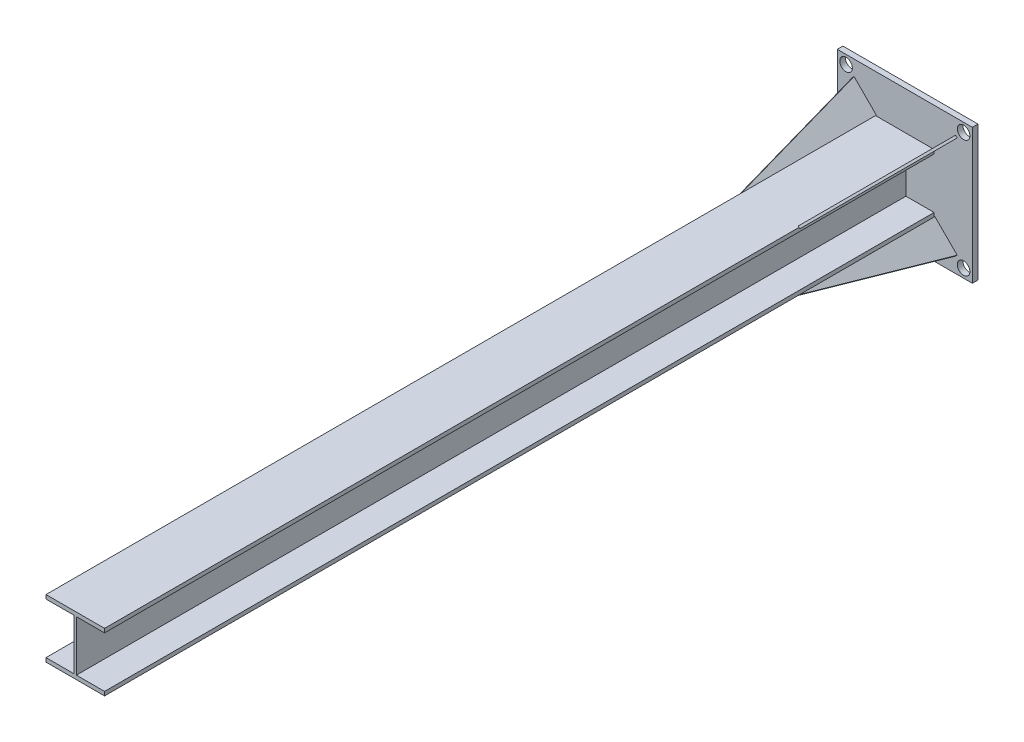
ISO-10303-21;
HEADER;
FILE_DESCRIPTION(('STEP AP214'),'2;1');
FILE_NAME('part.step','',(''),(''),'','','');
FILE_SCHEMA(('AUTOMOTIVE_DESIGN { 1 0 10303 214 1 1 1 1 }'));
ENDSEC;
DATA;
#1=APPLICATION_CONTEXT('core data for automotive mechanical design processes');
#2=APPLICATION_PROTOCOL_DEFINITION('international standard','automotive_design',2000,#1);
#3=PRODUCT_CONTEXT('',#1,'mechanical');
#4=PRODUCT('Part','Part','',(#3));
#5=PRODUCT_RELATED_PRODUCT_CATEGORY('part','',(#4));
#6=PRODUCT_DEFINITION_FORMATION('','',#4);
#7=PRODUCT_DEFINITION_CONTEXT('part definition',#1,'design');
#8=PRODUCT_DEFINITION('design','',#6,#7);
#9=PRODUCT_DEFINITION_SHAPE('','',#8);
#10=(LENGTH_UNIT() NAMED_UNIT(*) SI_UNIT(.MILLI.,.METRE.));
#11=(NAMED_UNIT(*) PLANE_ANGLE_UNIT() SI_UNIT($,.RADIAN.));
#12=(NAMED_UNIT(*) SI_UNIT($,.STERADIAN.) SOLID_ANGLE_UNIT());
#13=UNCERTAINTY_MEASURE_WITH_UNIT(LENGTH_MEASURE(1.E-05),#10,'distance_accuracy_value','');
#14=(GEOMETRIC_REPRESENTATION_CONTEXT(3) GLOBAL_UNCERTAINTY_ASSIGNED_CONTEXT((#13)) GLOBAL_UNIT_ASSIGNED_CONTEXT((#10,
#11,#12)) REPRESENTATION_CONTEXT('',''));
#15=CARTESIAN_POINT('',(0.,0.,0.));
#16=DIRECTION('',(0.,0.,1.));
#17=DIRECTION('',(1.,0.,0.));
#18=AXIS2_PLACEMENT_3D('',#15,#16,#17);
#19=CARTESIAN_POINT('',(3.5355342037314,256.464466391863,0.));
#20=DIRECTION('',(0.707106781186555,0.70710678118654,0.));
#21=DIRECTION('',(-0.70710678118654,0.707106781186555,0.));
#22=AXIS2_PLACEMENT_3D('',#19,#20,#21);
#23=PLANE('',#22);
#24=DIRECTION('',(0.,0.,-1.));
#25=VECTOR('',#24,1.);
#26=CARTESIAN_POINT('',(-3.535533608134,263.535534203729,0.));
#27=LINE('',#26,#25);
#28=CARTESIAN_POINT('',(-3.535533608134,263.535534203729,600.));
#29=VERTEX_POINT('',#28);
#30=CARTESIAN_POINT('',(-3.535533608134,263.535534203729,0.));
#31=VERTEX_POINT('',#30);
#32=EDGE_CURVE('E91',#29,#31,#27,.T.);
#33=ORIENTED_EDGE('',*,*,#32,.T.);
#34=DIRECTION('',(-0.70710678118654,0.707106781186555,0.));
#35=VECTOR('',#34,1.);
#36=CARTESIAN_POINT('',(3.5355342037314,256.464466391863,0.));
#37=LINE('',#36,#35);
#38=CARTESIAN_POINT('',(3.5355342037314,256.464466391863,0.));
#39=VERTEX_POINT('',#38);
#40=EDGE_CURVE('E12',#39,#31,#37,.T.);
#41=ORIENTED_EDGE('',*,*,#40,.F.);
#42=DIRECTION('',(0.,0.,-1.));
#43=VECTOR('',#42,1.);
#44=CARTESIAN_POINT('',(3.5355342037314,256.464466391863,0.));
#45=LINE('',#44,#43);
#46=CARTESIAN_POINT('',(3.5355342037314,256.464466391863,600.));
#47=VERTEX_POINT('',#46);
#48=EDGE_CURVE('E84',#47,#39,#45,.T.);
#49=ORIENTED_EDGE('',*,*,#48,.F.);
#50=DIRECTION('',(-0.70710678118654,0.707106781186555,0.));
#51=VECTOR('',#50,1.);
#52=CARTESIAN_POINT('',(3.5355342037314,256.464466391863,600.));
#53=LINE('',#52,#51);
#54=EDGE_CURVE('E92',#47,#29,#53,.T.);
#55=ORIENTED_EDGE('',*,*,#54,.T.);
#56=EDGE_LOOP('',(#33,#41,#49,#55));
#57=FACE_BOUND('',#56,.T.);
#58=ADVANCED_FACE('F44',(#57),#23,.F.);
#59=CARTESIAN_POINT('',(3.5355342037314,256.464466391863,0.));
#60=DIRECTION('',(0.,0.,1.));
#61=DIRECTION('',(0.,1.,0.));
#62=AXIS2_PLACEMENT_3D('',#59,#60,#61);
#63=PLANE('',#62);
#64=DIRECTION('',(0.707106781186555,0.70710678118654,0.));
#65=VECTOR('',#64,1.);
#66=CARTESIAN_POINT('',(-3.535533608134,263.535534203729,0.));
#67=LINE('',#66,#65);
#68=CARTESIAN_POINT('',(95.4594157579837,362.530483569844,0.));
#69=VERTEX_POINT('',#68);
#70=EDGE_CURVE('E72',#31,#69,#67,.T.);
#71=ORIENTED_EDGE('',*,*,#70,.T.);
#72=DIRECTION('',(-0.70710678118654,0.707106781186555,0.));
#73=VECTOR('',#72,1.);
#74=CARTESIAN_POINT('',(102.530483569849,355.459415757979,0.));
#75=LINE('',#74,#73);
#76=CARTESIAN_POINT('',(102.530483569849,355.459415757979,0.));
#77=VERTEX_POINT('',#76);
#78=EDGE_CURVE('E52',#77,#69,#75,.T.);
#79=ORIENTED_EDGE('',*,*,#78,.F.);
#80=DIRECTION('',(0.707106781186555,0.70710678118654,0.));
#81=VECTOR('',#80,1.);
#82=CARTESIAN_POINT('',(3.5355342037314,256.464466391863,0.));
#83=LINE('',#82,#81);
#84=EDGE_CURVE('E80',#39,#77,#83,.T.);
#85=ORIENTED_EDGE('',*,*,#84,.F.);
#86=ORIENTED_EDGE('',*,*,#40,.T.);
#87=EDGE_LOOP('',(#71,#79,#85,#86));
#88=FACE_BOUND('',#87,.T.);
#89=ADVANCED_FACE('F81',(#88),#63,.F.);
#90=CARTESIAN_POINT('',(3.5355342037314,256.464466391863,600.));
#91=DIRECTION('',(-0.68860972320734,-0.688609723207326,-0.227229615606418));
#92=DIRECTION('',(0.70710678118654,-0.707106781186555,0.));
#93=AXIS2_PLACEMENT_3D('',#90,#91,#92);
#94=PLANE('',#93);
#95=DIRECTION('',(-0.160675602081713,-0.160675602081709,0.973841209741793));
#96=VECTOR('',#95,1.);
#97=CARTESIAN_POINT('',(-3.535533608134,263.535534203729,600.));
#98=LINE('',#97,#96);
#99=EDGE_CURVE('E77',#69,#29,#98,.T.);
#100=ORIENTED_EDGE('',*,*,#99,.T.);
#101=ORIENTED_EDGE('',*,*,#54,.F.);
#102=DIRECTION('',(-0.160675602081713,-0.160675602081709,0.973841209741793));
#103=VECTOR('',#102,1.);
#104=CARTESIAN_POINT('',(3.5355342037314,256.464466391863,600.));
#105=LINE('',#104,#103);
#106=EDGE_CURVE('E60',#77,#47,#105,.T.);
#107=ORIENTED_EDGE('',*,*,#106,.F.);
#108=ORIENTED_EDGE('',*,*,#78,.T.);
#109=EDGE_LOOP('',(#100,#101,#107,#108));
#110=FACE_BOUND('',#109,.T.);
#111=ADVANCED_FACE('F99',(#110),#94,.F.);
#112=CARTESIAN_POINT('',(3.5355342037314,256.464466391863,0.));
#113=DIRECTION('',(-0.70710678118654,0.707106781186555,0.));
#114=DIRECTION('',(-0.707106781186555,-0.70710678118654,0.));
#115=AXIS2_PLACEMENT_3D('',#112,#113,#114);
#116=PLANE('',#115);
#117=ORIENTED_EDGE('',*,*,#48,.T.);
#118=ORIENTED_EDGE('',*,*,#84,.T.);
#119=ORIENTED_EDGE('',*,*,#106,.T.);
#120=EDGE_LOOP('',(#117,#118,#119));
#121=FACE_BOUND('',#120,.T.);
#122=ADVANCED_FACE('F87',(#121),#116,.F.);
#123=CARTESIAN_POINT('',(-3.535533608134,263.535534203729,0.));
#124=DIRECTION('',(-0.70710678118654,0.707106781186555,0.));
#125=DIRECTION('',(-0.707106781186555,-0.70710678118654,0.));
#126=AXIS2_PLACEMENT_3D('',#123,#124,#125);
#127=PLANE('',#126);
#128=ORIENTED_EDGE('',*,*,#32,.F.);
#129=ORIENTED_EDGE('',*,*,#99,.F.);
#130=ORIENTED_EDGE('',*,*,#70,.F.);
#131=EDGE_LOOP('',(#128,#129,#130));
#132=FACE_BOUND('',#131,.T.);
#133=ADVANCED_FACE('F100',(#132),#127,.T.);
#134=CLOSED_SHELL('',(#58,#89,#111,#122,#133));
#135=MANIFOLD_SOLID_BREP('B2',#134);
#136=CARTESIAN_POINT('',(-256.464466094067,263.535534501527,0.));
#137=DIRECTION('',(-0.707106781186548,0.707106781186548,0.));
#138=DIRECTION('',(-0.707106781186547,-0.707106781186548,0.));
#139=AXIS2_PLACEMENT_3D('',#136,#137,#138);
#140=PLANE('',#139);
#141=DIRECTION('',(0.,0.,-1.));
#142=VECTOR('',#141,1.);
#143=CARTESIAN_POINT('',(-263.535533905933,256.464466689662,0.));
#144=LINE('',#143,#142);
#145=CARTESIAN_POINT('',(-263.535533905933,256.464466689662,600.));
#146=VERTEX_POINT('',#145);
#147=CARTESIAN_POINT('',(-263.535533905933,256.464466689662,0.));
#148=VERTEX_POINT('',#147);
#149=EDGE_CURVE('E199',#146,#148,#144,.T.);
#150=ORIENTED_EDGE('',*,*,#149,.T.);
#151=DIRECTION('',(-0.707106781186548,-0.707106781186548,0.));
#152=VECTOR('',#151,1.);
#153=CARTESIAN_POINT('',(-256.464466094067,263.535534501527,0.));
#154=LINE('',#153,#152);
#155=CARTESIAN_POINT('',(-256.464466094067,263.535534501527,0.));
#156=VERTEX_POINT('',#155);
#157=EDGE_CURVE('E42',#156,#148,#154,.T.);
#158=ORIENTED_EDGE('',*,*,#157,.F.);
#159=DIRECTION('',(0.,0.,-1.));
#160=VECTOR('',#159,1.);
#161=CARTESIAN_POINT('',(-256.464466094067,263.535534501527,0.));
#162=LINE('',#161,#160);
#163=CARTESIAN_POINT('',(-256.464466094067,263.535534501527,600.));
#164=VERTEX_POINT('',#163);
#165=EDGE_CURVE('E192',#164,#156,#162,.T.);
#166=ORIENTED_EDGE('',*,*,#165,.F.);
#167=DIRECTION('',(-0.707106781186548,-0.707106781186548,0.));
#168=VECTOR('',#167,1.);
#169=CARTESIAN_POINT('',(-256.464466094067,263.535534501527,600.));
#170=LINE('',#169,#168);
#171=EDGE_CURVE('E200',#164,#146,#170,.T.);
#172=ORIENTED_EDGE('',*,*,#171,.T.);
#173=EDGE_LOOP('',(#150,#158,#166,#172));
#174=FACE_BOUND('',#173,.T.);
#175=ADVANCED_FACE('F152',(#174),#140,.F.);
#176=CARTESIAN_POINT('',(-256.464466094067,263.535534501527,0.));
#177=DIRECTION('',(0.,0.,1.));
#178=DIRECTION('',(-1.,0.,0.));
#179=AXIS2_PLACEMENT_3D('',#176,#177,#178);
#180=PLANE('',#179);
#181=DIRECTION('',(-0.707106781186548,0.707106781186547,0.));
#182=VECTOR('',#181,1.);
#183=CARTESIAN_POINT('',(-263.535533905933,256.464466689662,0.));
#184=LINE('',#183,#182);
#185=CARTESIAN_POINT('',(-362.530483272049,355.459416055779,0.));
#186=VERTEX_POINT('',#185);
#187=EDGE_CURVE('E180',#148,#186,#184,.T.);
#188=ORIENTED_EDGE('',*,*,#187,.T.);
#189=DIRECTION('',(-0.707106781186548,-0.707106781186548,0.));
#190=VECTOR('',#189,1.);
#191=CARTESIAN_POINT('',(-355.459415460184,362.530483867644,0.));
#192=LINE('',#191,#190);
#193=CARTESIAN_POINT('',(-355.459415460184,362.530483867644,0.));
#194=VERTEX_POINT('',#193);
#195=EDGE_CURVE('E160',#194,#186,#192,.T.);
#196=ORIENTED_EDGE('',*,*,#195,.F.);
#197=DIRECTION('',(-0.707106781186548,0.707106781186547,0.));
#198=VECTOR('',#197,1.);
#199=CARTESIAN_POINT('',(-256.464466094067,263.535534501527,0.));
#200=LINE('',#199,#198);
#201=EDGE_CURVE('E188',#156,#194,#200,.T.);
#202=ORIENTED_EDGE('',*,*,#201,.F.);
#203=ORIENTED_EDGE('',*,*,#157,.T.);
#204=EDGE_LOOP('',(#188,#196,#202,#203));
#205=FACE_BOUND('',#204,.T.);
#206=ADVANCED_FACE('F189',(#205),#180,.F.);
#207=CARTESIAN_POINT('',(-256.464466094067,263.535534501527,600.));
#208=DIRECTION('',(0.688609723207333,-0.688609723207333,-0.227229615606418));
#209=DIRECTION('',(0.707106781186547,0.707106781186548,0.));
#210=AXIS2_PLACEMENT_3D('',#207,#208,#209);
#211=PLANE('',#210);
#212=DIRECTION('',(0.160675602081711,-0.160675602081711,0.973841209741793));
#213=VECTOR('',#212,1.);
#214=CARTESIAN_POINT('',(-263.535533905933,256.464466689662,600.));
#215=LINE('',#214,#213);
#216=EDGE_CURVE('E185',#186,#146,#215,.T.);
#217=ORIENTED_EDGE('',*,*,#216,.T.);
#218=ORIENTED_EDGE('',*,*,#171,.F.);
#219=DIRECTION('',(0.160675602081711,-0.160675602081711,0.973841209741793));
#220=VECTOR('',#219,1.);
#221=CARTESIAN_POINT('',(-256.464466094067,263.535534501527,600.));
#222=LINE('',#221,#220);
#223=EDGE_CURVE('E168',#194,#164,#222,.T.);
#224=ORIENTED_EDGE('',*,*,#223,.F.);
#225=ORIENTED_EDGE('',*,*,#195,.T.);
#226=EDGE_LOOP('',(#217,#218,#224,#225));
#227=FACE_BOUND('',#226,.T.);
#228=ADVANCED_FACE('F207',(#227),#211,.F.);
#229=CARTESIAN_POINT('',(-256.464466094067,263.535534501527,0.));
#230=DIRECTION('',(-0.707106781186547,-0.707106781186548,0.));
#231=DIRECTION('',(0.707106781186548,-0.707106781186547,0.));
#232=AXIS2_PLACEMENT_3D('',#229,#230,#231);
#233=PLANE('',#232);
#234=ORIENTED_EDGE('',*,*,#165,.T.);
#235=ORIENTED_EDGE('',*,*,#201,.T.);
#236=ORIENTED_EDGE('',*,*,#223,.T.);
#237=EDGE_LOOP('',(#234,#235,#236));
#238=FACE_BOUND('',#237,.T.);
#239=ADVANCED_FACE('F195',(#238),#233,.F.);
#240=CARTESIAN_POINT('',(-263.535533905933,256.464466689662,0.));
#241=DIRECTION('',(-0.707106781186547,-0.707106781186548,0.));
#242=DIRECTION('',(0.707106781186548,-0.707106781186547,0.));
#243=AXIS2_PLACEMENT_3D('',#240,#241,#242);
#244=PLANE('',#243);
#245=ORIENTED_EDGE('',*,*,#149,.F.);
#246=ORIENTED_EDGE('',*,*,#216,.F.);
#247=ORIENTED_EDGE('',*,*,#187,.F.);
#248=EDGE_LOOP('',(#245,#246,#247));
#249=FACE_BOUND('',#248,.T.);
#250=ADVANCED_FACE('F208',(#249),#244,.T.);
#251=CLOSED_SHELL('',(#175,#206,#228,#239,#250));
#252=MANIFOLD_SOLID_BREP('B6',#251);
#253=CARTESIAN_POINT('',(-263.535534203731,3.53553420373054,0.));
#254=DIRECTION('',(-0.70710678118655,-0.707106781186545,0.));
#255=DIRECTION('',(0.707106781186545,-0.70710678118655,0.));
#256=AXIS2_PLACEMENT_3D('',#253,#254,#255);
#257=PLANE('',#256);
#258=DIRECTION('',(0.,0.,-1.));
#259=VECTOR('',#258,1.);
#260=CARTESIAN_POINT('',(-256.464466391865,-3.53553360813496,0.));
#261=LINE('',#260,#259);
#262=CARTESIAN_POINT('',(-256.464466391865,-3.53553360813496,600.));
#263=VERTEX_POINT('',#262);
#264=CARTESIAN_POINT('',(-256.464466391865,-3.53553360813496,0.));
#265=VERTEX_POINT('',#264);
#266=EDGE_CURVE('E307',#263,#265,#261,.T.);
#267=ORIENTED_EDGE('',*,*,#266,.T.);
#268=DIRECTION('',(0.707106781186545,-0.70710678118655,0.));
#269=VECTOR('',#268,1.);
#270=CARTESIAN_POINT('',(-263.535534203731,3.53553420373054,0.));
#271=LINE('',#270,#269);
#272=CARTESIAN_POINT('',(-263.535534203731,3.53553420373054,0.));
#273=VERTEX_POINT('',#272);
#274=EDGE_CURVE('E150',#273,#265,#271,.T.);
#275=ORIENTED_EDGE('',*,*,#274,.F.);
#276=DIRECTION('',(0.,0.,-1.));
#277=VECTOR('',#276,1.);
#278=CARTESIAN_POINT('',(-263.535534203731,3.53553420373054,0.));
#279=LINE('',#278,#277);
#280=CARTESIAN_POINT('',(-263.535534203731,3.53553420373054,600.));
#281=VERTEX_POINT('',#280);
#282=EDGE_CURVE('E300',#281,#273,#279,.T.);
#283=ORIENTED_EDGE('',*,*,#282,.F.);
#284=DIRECTION('',(0.707106781186545,-0.70710678118655,0.));
#285=VECTOR('',#284,1.);
#286=CARTESIAN_POINT('',(-263.535534203731,3.53553420373054,600.));
#287=LINE('',#286,#285);
#288=EDGE_CURVE('E308',#281,#263,#287,.T.);
#289=ORIENTED_EDGE('',*,*,#288,.T.);
#290=EDGE_LOOP('',(#267,#275,#283,#289));
#291=FACE_BOUND('',#290,.T.);
#292=ADVANCED_FACE('F260',(#291),#257,.F.);
#293=CARTESIAN_POINT('',(-263.535534203731,3.53553420373054,0.));
#294=DIRECTION('',(0.,0.,1.));
#295=DIRECTION('',(0.,-1.,0.));
#296=AXIS2_PLACEMENT_3D('',#293,#294,#295);
#297=PLANE('',#296);
#298=DIRECTION('',(-0.70710678118655,-0.707106781186545,0.));
#299=VECTOR('',#298,1.);
#300=CARTESIAN_POINT('',(-256.464466391865,-3.53553360813496,0.));
#301=LINE('',#300,#299);
#302=CARTESIAN_POINT('',(-355.459415757982,-102.530482974251,0.));
#303=VERTEX_POINT('',#302);
#304=EDGE_CURVE('E288',#265,#303,#301,.T.);
#305=ORIENTED_EDGE('',*,*,#304,.T.);
#306=DIRECTION('',(0.707106781186545,-0.70710678118655,0.));
#307=VECTOR('',#306,1.);
#308=CARTESIAN_POINT('',(-362.530483569847,-95.4594151623858,0.));
#309=LINE('',#308,#307);
#310=CARTESIAN_POINT('',(-362.530483569847,-95.4594151623858,0.));
#311=VERTEX_POINT('',#310);
#312=EDGE_CURVE('E268',#311,#303,#309,.T.);
#313=ORIENTED_EDGE('',*,*,#312,.F.);
#314=DIRECTION('',(-0.70710678118655,-0.707106781186545,0.));
#315=VECTOR('',#314,1.);
#316=CARTESIAN_POINT('',(-263.535534203731,3.53553420373054,0.));
#317=LINE('',#316,#315);
#318=EDGE_CURVE('E296',#273,#311,#317,.T.);
#319=ORIENTED_EDGE('',*,*,#318,.F.);
#320=ORIENTED_EDGE('',*,*,#274,.T.);
#321=EDGE_LOOP('',(#305,#313,#319,#320));
#322=FACE_BOUND('',#321,.T.);
#323=ADVANCED_FACE('F297',(#322),#297,.F.);
#324=CARTESIAN_POINT('',(-263.535534203731,3.53553420373054,600.));
#325=DIRECTION('',(0.688609723207335,0.688609723207331,-0.227229615606418));
#326=DIRECTION('',(-0.707106781186545,0.70710678118655,0.));
#327=AXIS2_PLACEMENT_3D('',#324,#325,#326);
#328=PLANE('',#327);
#329=DIRECTION('',(0.160675602081712,0.16067560208171,0.973841209741793));
#330=VECTOR('',#329,1.);
#331=CARTESIAN_POINT('',(-256.464466391865,-3.53553360813496,600.));
#332=LINE('',#331,#330);
#333=EDGE_CURVE('E293',#303,#263,#332,.T.);
#334=ORIENTED_EDGE('',*,*,#333,.T.);
#335=ORIENTED_EDGE('',*,*,#288,.F.);
#336=DIRECTION('',(0.160675602081712,0.16067560208171,0.973841209741793));
#337=VECTOR('',#336,1.);
#338=CARTESIAN_POINT('',(-263.535534203731,3.53553420373054,600.));
#339=LINE('',#338,#337);
#340=EDGE_CURVE('E276',#311,#281,#339,.T.);
#341=ORIENTED_EDGE('',*,*,#340,.F.);
#342=ORIENTED_EDGE('',*,*,#312,.T.);
#343=EDGE_LOOP('',(#334,#335,#341,#342));
#344=FACE_BOUND('',#343,.T.);
#345=ADVANCED_FACE('F315',(#344),#328,.F.);
#346=CARTESIAN_POINT('',(-263.535534203731,3.53553420373054,0.));
#347=DIRECTION('',(0.707106781186545,-0.70710678118655,0.));
#348=DIRECTION('',(0.70710678118655,0.707106781186545,0.));
#349=AXIS2_PLACEMENT_3D('',#346,#347,#348);
#350=PLANE('',#349);
#351=ORIENTED_EDGE('',*,*,#282,.T.);
#352=ORIENTED_EDGE('',*,*,#318,.T.);
#353=ORIENTED_EDGE('',*,*,#340,.T.);
#354=EDGE_LOOP('',(#351,#352,#353));
#355=FACE_BOUND('',#354,.T.);
#356=ADVANCED_FACE('F303',(#355),#350,.F.);
#357=CARTESIAN_POINT('',(-256.464466391865,-3.53553360813496,0.));
#358=DIRECTION('',(0.707106781186545,-0.70710678118655,0.));
#359=DIRECTION('',(0.70710678118655,0.707106781186545,0.));
#360=AXIS2_PLACEMENT_3D('',#357,#358,#359);
#361=PLANE('',#360);
#362=ORIENTED_EDGE('',*,*,#266,.F.);
#363=ORIENTED_EDGE('',*,*,#333,.F.);
#364=ORIENTED_EDGE('',*,*,#304,.F.);
#365=EDGE_LOOP('',(#362,#363,#364));
#366=FACE_BOUND('',#365,.T.);
#367=ADVANCED_FACE('F316',(#366),#361,.T.);
#368=CLOSED_SHELL('',(#292,#323,#345,#356,#367));
#369=MANIFOLD_SOLID_BREP('B36',#368);
#370=CARTESIAN_POINT('',(-3.53553390593274,-3.53553390593274,0.));
#371=DIRECTION('',(0.707106781186548,-0.707106781186548,0.));
#372=DIRECTION('',(0.707106781186547,0.707106781186548,0.));
#373=AXIS2_PLACEMENT_3D('',#370,#371,#372);
#374=PLANE('',#373);
#375=DIRECTION('',(0.,0.,-1.));
#376=VECTOR('',#375,1.);
#377=CARTESIAN_POINT('',(3.53553390593274,3.53553390593274,0.));
#378=LINE('',#377,#376);
#379=CARTESIAN_POINT('',(3.53553390593274,3.53553390593274,600.));
#380=VERTEX_POINT('',#379);
#381=CARTESIAN_POINT('',(3.53553390593274,3.53553390593274,0.));
#382=VERTEX_POINT('',#381);
#383=EDGE_CURVE('E415',#380,#382,#378,.T.);
#384=ORIENTED_EDGE('',*,*,#383,.T.);
#385=DIRECTION('',(0.707106781186548,0.707106781186548,0.));
#386=VECTOR('',#385,1.);
#387=CARTESIAN_POINT('',(-3.53553390593274,-3.53553390593274,0.));
#388=LINE('',#387,#386);
#389=CARTESIAN_POINT('',(-3.53553390593274,-3.53553390593274,0.));
#390=VERTEX_POINT('',#389);
#391=EDGE_CURVE('E258',#390,#382,#388,.T.);
#392=ORIENTED_EDGE('',*,*,#391,.F.);
#393=DIRECTION('',(0.,0.,-1.));
#394=VECTOR('',#393,1.);
#395=CARTESIAN_POINT('',(-3.53553390593274,-3.53553390593274,0.));
#396=LINE('',#395,#394);
#397=CARTESIAN_POINT('',(-3.53553390593274,-3.53553390593274,600.));
#398=VERTEX_POINT('',#397);
#399=EDGE_CURVE('E408',#398,#390,#396,.T.);
#400=ORIENTED_EDGE('',*,*,#399,.F.);
#401=DIRECTION('',(0.707106781186548,0.707106781186548,0.));
#402=VECTOR('',#401,1.);
#403=CARTESIAN_POINT('',(-3.53553390593274,-3.53553390593274,600.));
#404=LINE('',#403,#402);
#405=EDGE_CURVE('E416',#398,#380,#404,.T.);
#406=ORIENTED_EDGE('',*,*,#405,.T.);
#407=EDGE_LOOP('',(#384,#392,#400,#406));
#408=FACE_BOUND('',#407,.T.);
#409=ADVANCED_FACE('F368',(#408),#374,.F.);
#410=CARTESIAN_POINT('',(-3.53553390593274,-3.53553390593274,0.));
#411=DIRECTION('',(0.,0.,1.));
#412=DIRECTION('',(1.,0.,0.));
#413=AXIS2_PLACEMENT_3D('',#410,#411,#412);
#414=PLANE('',#413);
#415=DIRECTION('',(0.707106781186548,-0.707106781186547,0.));
#416=VECTOR('',#415,1.);
#417=CARTESIAN_POINT('',(3.53553390593274,3.53553390593274,0.));
#418=LINE('',#417,#416);
#419=CARTESIAN_POINT('',(102.530483272049,-95.4594154601839,0.));
#420=VERTEX_POINT('',#419);
#421=EDGE_CURVE('E396',#382,#420,#418,.T.);
#422=ORIENTED_EDGE('',*,*,#421,.T.);
#423=DIRECTION('',(0.707106781186548,0.707106781186548,0.));
#424=VECTOR('',#423,1.);
#425=CARTESIAN_POINT('',(95.4594154601839,-102.530483272049,0.));
#426=LINE('',#425,#424);
#427=CARTESIAN_POINT('',(95.4594154601839,-102.530483272049,0.));
#428=VERTEX_POINT('',#427);
#429=EDGE_CURVE('E376',#428,#420,#426,.T.);
#430=ORIENTED_EDGE('',*,*,#429,.F.);
#431=DIRECTION('',(0.707106781186548,-0.707106781186547,0.));
#432=VECTOR('',#431,1.);
#433=CARTESIAN_POINT('',(-3.53553390593274,-3.53553390593274,0.));
#434=LINE('',#433,#432);
#435=EDGE_CURVE('E404',#390,#428,#434,.T.);
#436=ORIENTED_EDGE('',*,*,#435,.F.);
#437=ORIENTED_EDGE('',*,*,#391,.T.);
#438=EDGE_LOOP('',(#422,#430,#436,#437));
#439=FACE_BOUND('',#438,.T.);
#440=ADVANCED_FACE('F405',(#439),#414,.F.);
#441=CARTESIAN_POINT('',(-3.53553390593274,-3.53553390593274,600.));
#442=DIRECTION('',(-0.688609723207333,0.688609723207333,-0.227229615606418));
#443=DIRECTION('',(-0.707106781186547,-0.707106781186548,0.));
#444=AXIS2_PLACEMENT_3D('',#441,#442,#443);
#445=PLANE('',#444);
#446=DIRECTION('',(-0.160675602081711,0.160675602081711,0.973841209741793));
#447=VECTOR('',#446,1.);
#448=CARTESIAN_POINT('',(3.53553390593274,3.53553390593274,600.));
#449=LINE('',#448,#447);
#450=EDGE_CURVE('E401',#420,#380,#449,.T.);
#451=ORIENTED_EDGE('',*,*,#450,.T.);
#452=ORIENTED_EDGE('',*,*,#405,.F.);
#453=DIRECTION('',(-0.160675602081711,0.160675602081711,0.973841209741793));
#454=VECTOR('',#453,1.);
#455=CARTESIAN_POINT('',(-3.53553390593274,-3.53553390593274,600.));
#456=LINE('',#455,#454);
#457=EDGE_CURVE('E384',#428,#398,#456,.T.);
#458=ORIENTED_EDGE('',*,*,#457,.F.);
#459=ORIENTED_EDGE('',*,*,#429,.T.);
#460=EDGE_LOOP('',(#451,#452,#458,#459));
#461=FACE_BOUND('',#460,.T.);
#462=ADVANCED_FACE('F423',(#461),#445,.F.);
#463=CARTESIAN_POINT('',(-3.53553390593274,-3.53553390593274,0.));
#464=DIRECTION('',(0.707106781186547,0.707106781186548,0.));
#465=DIRECTION('',(-0.707106781186548,0.707106781186547,0.));
#466=AXIS2_PLACEMENT_3D('',#463,#464,#465);
#467=PLANE('',#466);
#468=ORIENTED_EDGE('',*,*,#399,.T.);
#469=ORIENTED_EDGE('',*,*,#435,.T.);
#470=ORIENTED_EDGE('',*,*,#457,.T.);
#471=EDGE_LOOP('',(#468,#469,#470));
#472=FACE_BOUND('',#471,.T.);
#473=ADVANCED_FACE('F411',(#472),#467,.F.);
#474=CARTESIAN_POINT('',(3.53553390593274,3.53553390593274,0.));
#475=DIRECTION('',(0.707106781186547,0.707106781186548,0.));
#476=DIRECTION('',(-0.707106781186548,0.707106781186547,0.));
#477=AXIS2_PLACEMENT_3D('',#474,#475,#476);
#478=PLANE('',#477);
#479=ORIENTED_EDGE('',*,*,#383,.F.);
#480=ORIENTED_EDGE('',*,*,#450,.F.);
#481=ORIENTED_EDGE('',*,*,#421,.F.);
#482=EDGE_LOOP('',(#479,#480,#481));
#483=FACE_BOUND('',#482,.T.);
#484=ADVANCED_FACE('F424',(#483),#478,.T.);
#485=CLOSED_SHELL('',(#409,#440,#462,#473,#484));
#486=MANIFOLD_SOLID_BREP('B144',#485);
#487=CARTESIAN_POINT('',(170.,-170.,-25.));
#488=DIRECTION('',(1.,0.,0.));
#489=DIRECTION('',(0.,0.,-1.));
#490=AXIS2_PLACEMENT_3D('',#487,#488,#489);
#491=PLANE('',#490);
#492=DIRECTION('',(0.,1.,0.));
#493=VECTOR('',#492,1.);
#494=CARTESIAN_POINT('',(170.,-170.,0.));
#495=LINE('',#494,#493);
#496=CARTESIAN_POINT('',(170.,-170.,0.));
#497=VERTEX_POINT('',#496);
#498=CARTESIAN_POINT('',(170.,430.,0.));
#499=VERTEX_POINT('',#498);
#500=EDGE_CURVE('E540',#497,#499,#495,.T.);
#501=ORIENTED_EDGE('',*,*,#500,.F.);
#502=DIRECTION('',(0.,0.,1.));
#503=VECTOR('',#502,1.);
#504=CARTESIAN_POINT('',(170.,-170.,-25.));
#505=LINE('',#504,#503);
#506=CARTESIAN_POINT('',(170.,-170.,-25.));
#507=VERTEX_POINT('',#506);
#508=EDGE_CURVE('E366',#507,#497,#505,.T.);
#509=ORIENTED_EDGE('',*,*,#508,.F.);
#510=DIRECTION('',(0.,1.,0.));
#511=VECTOR('',#510,1.);
#512=CARTESIAN_POINT('',(170.,-170.,-25.));
#513=LINE('',#512,#511);
#514=CARTESIAN_POINT('',(170.,430.,-25.));
#515=VERTEX_POINT('',#514);
#516=EDGE_CURVE('E533',#507,#515,#513,.T.);
#517=ORIENTED_EDGE('',*,*,#516,.T.);
#518=DIRECTION('',(0.,0.,1.));
#519=VECTOR('',#518,1.);
#520=CARTESIAN_POINT('',(170.,430.,-25.));
#521=LINE('',#520,#519);
#522=EDGE_CURVE('E478',#515,#499,#521,.T.);
#523=ORIENTED_EDGE('',*,*,#522,.T.);
#524=EDGE_LOOP('',(#501,#509,#517,#523));
#525=FACE_BOUND('',#524,.T.);
#526=ADVANCED_FACE('F475',(#525),#491,.T.);
#527=CARTESIAN_POINT('',(170.,-170.,-25.));
#528=DIRECTION('',(0.,-1.,0.));
#529=DIRECTION('',(1.,0.,0.));
#530=AXIS2_PLACEMENT_3D('',#527,#528,#529);
#531=PLANE('',#530);
#532=DIRECTION('',(1.,0.,0.));
#533=VECTOR('',#532,1.);
#534=CARTESIAN_POINT('',(170.,-170.,0.));
#535=LINE('',#534,#533);
#536=CARTESIAN_POINT('',(-430.,-170.,0.));
#537=VERTEX_POINT('',#536);
#538=EDGE_CURVE('E535',#537,#497,#535,.T.);
#539=ORIENTED_EDGE('',*,*,#538,.F.);
#540=DIRECTION('',(0.,0.,1.));
#541=VECTOR('',#540,1.);
#542=CARTESIAN_POINT('',(-430.,-170.,-25.));
#543=LINE('',#542,#541);
#544=CARTESIAN_POINT('',(-430.,-170.,-25.));
#545=VERTEX_POINT('',#544);
#546=EDGE_CURVE('E484',#545,#537,#543,.T.);
#547=ORIENTED_EDGE('',*,*,#546,.F.);
#548=DIRECTION('',(1.,0.,0.));
#549=VECTOR('',#548,1.);
#550=CARTESIAN_POINT('',(170.,-170.,-25.));
#551=LINE('',#550,#549);
#552=EDGE_CURVE('E530',#545,#507,#551,.T.);
#553=ORIENTED_EDGE('',*,*,#552,.T.);
#554=ORIENTED_EDGE('',*,*,#508,.T.);
#555=EDGE_LOOP('',(#539,#547,#553,#554));
#556=FACE_BOUND('',#555,.T.);
#557=ADVANCED_FACE('F551',(#556),#531,.T.);
#558=CARTESIAN_POINT('',(-430.,-170.,-25.));
#559=DIRECTION('',(-1.,0.,0.));
#560=DIRECTION('',(0.,-1.,0.));
#561=AXIS2_PLACEMENT_3D('',#558,#559,#560);
#562=PLANE('',#561);
#563=DIRECTION('',(0.,-1.,0.));
#564=VECTOR('',#563,1.);
#565=CARTESIAN_POINT('',(-430.,-170.,0.));
#566=LINE('',#565,#564);
#567=CARTESIAN_POINT('',(-430.,430.,0.));
#568=VERTEX_POINT('',#567);
#569=EDGE_CURVE('E525',#568,#537,#566,.T.);
#570=ORIENTED_EDGE('',*,*,#569,.F.);
#571=DIRECTION('',(0.,0.,1.));
#572=VECTOR('',#571,1.);
#573=CARTESIAN_POINT('',(-430.,430.,-25.));
#574=LINE('',#573,#572);
#575=CARTESIAN_POINT('',(-430.,430.,-25.));
#576=VERTEX_POINT('',#575);
#577=EDGE_CURVE('E520',#576,#568,#574,.T.);
#578=ORIENTED_EDGE('',*,*,#577,.F.);
#579=DIRECTION('',(0.,-1.,0.));
#580=VECTOR('',#579,1.);
#581=CARTESIAN_POINT('',(-430.,-170.,-25.));
#582=LINE('',#581,#580);
#583=EDGE_CURVE('E523',#576,#545,#582,.T.);
#584=ORIENTED_EDGE('',*,*,#583,.T.);
#585=ORIENTED_EDGE('',*,*,#546,.T.);
#586=EDGE_LOOP('',(#570,#578,#584,#585));
#587=FACE_BOUND('',#586,.T.);
#588=ADVANCED_FACE('F522',(#587),#562,.T.);
#589=CARTESIAN_POINT('',(170.,430.,-25.));
#590=DIRECTION('',(0.,1.,0.));
#591=DIRECTION('',(-1.,0.,0.));
#592=AXIS2_PLACEMENT_3D('',#589,#590,#591);
#593=PLANE('',#592);
#594=DIRECTION('',(-1.,0.,0.));
#595=VECTOR('',#594,1.);
#596=CARTESIAN_POINT('',(170.,430.,0.));
#597=LINE('',#596,#595);
#598=EDGE_CURVE('E543',#499,#568,#597,.T.);
#599=ORIENTED_EDGE('',*,*,#598,.F.);
#600=ORIENTED_EDGE('',*,*,#522,.F.);
#601=DIRECTION('',(-1.,0.,0.));
#602=VECTOR('',#601,1.);
#603=CARTESIAN_POINT('',(170.,430.,-25.));
#604=LINE('',#603,#602);
#605=EDGE_CURVE('E529',#515,#576,#604,.T.);
#606=ORIENTED_EDGE('',*,*,#605,.T.);
#607=ORIENTED_EDGE('',*,*,#577,.T.);
#608=EDGE_LOOP('',(#599,#600,#606,#607));
#609=FACE_BOUND('',#608,.T.);
#610=ADVANCED_FACE('F532',(#609),#593,.T.);
#611=CARTESIAN_POINT('',(170.,430.,-25.));
#612=DIRECTION('',(0.,0.,1.));
#613=DIRECTION('',(1.,0.,0.));
#614=AXIS2_PLACEMENT_3D('',#611,#612,#613);
#615=PLANE('',#614);
#616=CARTESIAN_POINT('',(-391.,-131.,-25.));
#617=DIRECTION('',(0.,0.,1.));
#618=DIRECTION('',(1.,0.,0.));
#619=AXIS2_PLACEMENT_3D('',#616,#617,#618);
#620=CIRCLE('',#619,28.);
#621=CARTESIAN_POINT('',(-363.,-131.,-25.));
#622=VERTEX_POINT('',#621);
#623=EDGE_CURVE('E592',#622,#622,#620,.T.);
#624=ORIENTED_EDGE('',*,*,#623,.T.);
#625=EDGE_LOOP('',(#624));
#626=FACE_BOUND('',#625,.T.);
#627=CARTESIAN_POINT('',(131.,-131.,-25.));
#628=DIRECTION('',(0.,0.,1.));
#629=DIRECTION('',(1.,0.,0.));
#630=AXIS2_PLACEMENT_3D('',#627,#628,#629);
#631=CIRCLE('',#630,28.);
#632=CARTESIAN_POINT('',(159.,-131.,-25.));
#633=VERTEX_POINT('',#632);
#634=EDGE_CURVE('E600',#633,#633,#631,.T.);
#635=ORIENTED_EDGE('',*,*,#634,.T.);
#636=EDGE_LOOP('',(#635));
#637=FACE_BOUND('',#636,.T.);
#638=CARTESIAN_POINT('',(131.,391.,-25.));
#639=DIRECTION('',(0.,0.,1.));
#640=DIRECTION('',(1.,0.,0.));
#641=AXIS2_PLACEMENT_3D('',#638,#639,#640);
#642=CIRCLE('',#641,28.);
#643=CARTESIAN_POINT('',(159.,391.,-25.));
#644=VERTEX_POINT('',#643);
#645=EDGE_CURVE('E606',#644,#644,#642,.T.);
#646=ORIENTED_EDGE('',*,*,#645,.T.);
#647=EDGE_LOOP('',(#646));
#648=FACE_BOUND('',#647,.T.);
#649=CARTESIAN_POINT('',(-391.,391.,-25.));
#650=DIRECTION('',(0.,0.,1.));
#651=DIRECTION('',(1.,0.,0.));
#652=AXIS2_PLACEMENT_3D('',#649,#650,#651);
#653=CIRCLE('',#652,28.);
#654=CARTESIAN_POINT('',(-363.,391.,-25.));
#655=VERTEX_POINT('',#654);
#656=EDGE_CURVE('E544',#655,#655,#653,.T.);
#657=ORIENTED_EDGE('',*,*,#656,.T.);
#658=EDGE_LOOP('',(#657));
#659=FACE_BOUND('',#658,.T.);
#660=ORIENTED_EDGE('',*,*,#516,.F.);
#661=ORIENTED_EDGE('',*,*,#552,.F.);
#662=ORIENTED_EDGE('',*,*,#583,.F.);
#663=ORIENTED_EDGE('',*,*,#605,.F.);
#664=EDGE_LOOP('',(#660,#661,#662,#663));
#665=FACE_BOUND('',#664,.T.);
#666=ADVANCED_FACE('F528',(#626,#637,#648,#659,#665),#615,.F.);
#667=CARTESIAN_POINT('',(170.,430.,0.));
#668=DIRECTION('',(0.,0.,1.));
#669=DIRECTION('',(1.,0.,0.));
#670=AXIS2_PLACEMENT_3D('',#667,#668,#669);
#671=PLANE('',#670);
#672=CARTESIAN_POINT('',(-391.,-131.,0.));
#673=DIRECTION('',(0.,0.,1.));
#674=DIRECTION('',(1.,0.,0.));
#675=AXIS2_PLACEMENT_3D('',#672,#673,#674);
#676=CIRCLE('',#675,28.);
#677=CARTESIAN_POINT('',(-363.,-131.,0.));
#678=VERTEX_POINT('',#677);
#679=EDGE_CURVE('E595',#678,#678,#676,.T.);
#680=ORIENTED_EDGE('',*,*,#679,.F.);
#681=EDGE_LOOP('',(#680));
#682=FACE_BOUND('',#681,.T.);
#683=CARTESIAN_POINT('',(131.,-131.,0.));
#684=DIRECTION('',(0.,0.,1.));
#685=DIRECTION('',(1.,0.,0.));
#686=AXIS2_PLACEMENT_3D('',#683,#684,#685);
#687=CIRCLE('',#686,28.);
#688=CARTESIAN_POINT('',(159.,-131.,0.));
#689=VERTEX_POINT('',#688);
#690=EDGE_CURVE('E597',#689,#689,#687,.T.);
#691=ORIENTED_EDGE('',*,*,#690,.F.);
#692=EDGE_LOOP('',(#691));
#693=FACE_BOUND('',#692,.T.);
#694=CARTESIAN_POINT('',(131.,391.,0.));
#695=DIRECTION('',(0.,0.,1.));
#696=DIRECTION('',(1.,0.,0.));
#697=AXIS2_PLACEMENT_3D('',#694,#695,#696);
#698=CIRCLE('',#697,28.);
#699=CARTESIAN_POINT('',(159.,391.,0.));
#700=VERTEX_POINT('',#699);
#701=EDGE_CURVE('E603',#700,#700,#698,.T.);
#702=ORIENTED_EDGE('',*,*,#701,.F.);
#703=EDGE_LOOP('',(#702));
#704=FACE_BOUND('',#703,.T.);
#705=CARTESIAN_POINT('',(-391.,391.,0.));
#706=DIRECTION('',(0.,0.,1.));
#707=DIRECTION('',(1.,0.,0.));
#708=AXIS2_PLACEMENT_3D('',#705,#706,#707);
#709=CIRCLE('',#708,28.);
#710=CARTESIAN_POINT('',(-363.,391.,0.));
#711=VERTEX_POINT('',#710);
#712=EDGE_CURVE('E609',#711,#711,#709,.T.);
#713=ORIENTED_EDGE('',*,*,#712,.F.);
#714=EDGE_LOOP('',(#713));
#715=FACE_BOUND('',#714,.T.);
#716=ORIENTED_EDGE('',*,*,#500,.T.);
#717=ORIENTED_EDGE('',*,*,#598,.T.);
#718=ORIENTED_EDGE('',*,*,#569,.T.);
#719=ORIENTED_EDGE('',*,*,#538,.T.);
#720=EDGE_LOOP('',(#716,#717,#718,#719));
#721=FACE_BOUND('',#720,.T.);
#722=ADVANCED_FACE('F550',(#682,#693,#704,#715,#721),#671,.T.);
#723=CARTESIAN_POINT('',(-391.,391.,-25.));
#724=DIRECTION('',(0.,0.,1.));
#725=DIRECTION('',(1.,0.,0.));
#726=AXIS2_PLACEMENT_3D('',#723,#724,#725);
#727=CYLINDRICAL_SURFACE('',#726,28.);
#728=ORIENTED_EDGE('',*,*,#656,.F.);
#729=EDGE_LOOP('',(#728));
#730=FACE_BOUND('',#729,.T.);
#731=ORIENTED_EDGE('',*,*,#712,.T.);
#732=EDGE_LOOP('',(#731));
#733=FACE_BOUND('',#732,.T.);
#734=ADVANCED_FACE('F569',(#730,#733),#727,.F.);
#735=CARTESIAN_POINT('',(131.,391.,-25.));
#736=DIRECTION('',(0.,0.,1.));
#737=DIRECTION('',(1.,0.,0.));
#738=AXIS2_PLACEMENT_3D('',#735,#736,#737);
#739=CYLINDRICAL_SURFACE('',#738,28.);
#740=ORIENTED_EDGE('',*,*,#645,.F.);
#741=EDGE_LOOP('',(#740));
#742=FACE_BOUND('',#741,.T.);
#743=ORIENTED_EDGE('',*,*,#701,.T.);
#744=EDGE_LOOP('',(#743));
#745=FACE_BOUND('',#744,.T.);
#746=ADVANCED_FACE('F576',(#742,#745),#739,.F.);
#747=CARTESIAN_POINT('',(131.,-131.,-25.));
#748=DIRECTION('',(0.,0.,1.));
#749=DIRECTION('',(1.,0.,0.));
#750=AXIS2_PLACEMENT_3D('',#747,#748,#749);
#751=CYLINDRICAL_SURFACE('',#750,28.);
#752=ORIENTED_EDGE('',*,*,#634,.F.);
#753=EDGE_LOOP('',(#752));
#754=FACE_BOUND('',#753,.T.);
#755=ORIENTED_EDGE('',*,*,#690,.T.);
#756=EDGE_LOOP('',(#755));
#757=FACE_BOUND('',#756,.T.);
#758=ADVANCED_FACE('F580',(#754,#757),#751,.F.);
#759=CARTESIAN_POINT('',(-391.,-131.,-25.));
#760=DIRECTION('',(0.,0.,1.));
#761=DIRECTION('',(1.,0.,0.));
#762=AXIS2_PLACEMENT_3D('',#759,#760,#761);
#763=CYLINDRICAL_SURFACE('',#762,28.);
#764=ORIENTED_EDGE('',*,*,#623,.F.);
#765=EDGE_LOOP('',(#764));
#766=FACE_BOUND('',#765,.T.);
#767=ORIENTED_EDGE('',*,*,#679,.T.);
#768=EDGE_LOOP('',(#767));
#769=FACE_BOUND('',#768,.T.);
#770=ADVANCED_FACE('F584',(#766,#769),#763,.F.);
#771=CLOSED_SHELL('',(#526,#557,#588,#610,#666,#722,#734,#746,#758,#770));
#772=MANIFOLD_SOLID_BREP('B252',#771);
#773=CARTESIAN_POINT('',(-135.,17.5,3684.));
#774=DIRECTION('',(1.,0.,0.));
#775=DIRECTION('',(0.,0.,-1.));
#776=AXIS2_PLACEMENT_3D('',#773,#774,#775);
#777=PLANE('',#776);
#778=DIRECTION('',(0.,-1.,0.));
#779=VECTOR('',#778,1.);
#780=CARTESIAN_POINT('',(-135.,17.5,0.));
#781=LINE('',#780,#779);
#782=CARTESIAN_POINT('',(-135.,242.5,0.));
#783=VERTEX_POINT('',#782);
#784=CARTESIAN_POINT('',(-135.,17.5,0.));
#785=VERTEX_POINT('',#784);
#786=EDGE_CURVE('E803',#783,#785,#781,.T.);
#787=ORIENTED_EDGE('',*,*,#786,.T.);
#788=DIRECTION('',(0.,0.,-1.));
#789=VECTOR('',#788,1.);
#790=CARTESIAN_POINT('',(-135.,17.5,3684.));
#791=LINE('',#790,#789);
#792=CARTESIAN_POINT('',(-135.,17.5,3684.));
#793=VERTEX_POINT('',#792);
#794=EDGE_CURVE('E473',#793,#785,#791,.T.);
#795=ORIENTED_EDGE('',*,*,#794,.F.);
#796=DIRECTION('',(0.,-1.,0.));
#797=VECTOR('',#796,1.);
#798=CARTESIAN_POINT('',(-135.,17.5,3684.));
#799=LINE('',#798,#797);
#800=CARTESIAN_POINT('',(-135.,242.5,3684.));
#801=VERTEX_POINT('',#800);
#802=EDGE_CURVE('E825',#801,#793,#799,.T.);
#803=ORIENTED_EDGE('',*,*,#802,.F.);
#804=DIRECTION('',(0.,0.,-1.));
#805=VECTOR('',#804,1.);
#806=CARTESIAN_POINT('',(-135.,242.5,3684.));
#807=LINE('',#806,#805);
#808=EDGE_CURVE('E799',#801,#783,#807,.T.);
#809=ORIENTED_EDGE('',*,*,#808,.T.);
#810=EDGE_LOOP('',(#787,#795,#803,#809));
#811=FACE_BOUND('',#810,.T.);
#812=ADVANCED_FACE('F683',(#811),#777,.F.);
#813=CARTESIAN_POINT('',(-135.,17.5,3684.));
#814=DIRECTION('',(0.,-1.,0.));
#815=DIRECTION('',(0.,0.,-1.));
#816=AXIS2_PLACEMENT_3D('',#813,#814,#815);
#817=PLANE('',#816);
#818=DIRECTION('',(-1.,0.,0.));
#819=VECTOR('',#818,1.);
#820=CARTESIAN_POINT('',(-135.,17.5,0.));
#821=LINE('',#820,#819);
#822=CARTESIAN_POINT('',(-260.,17.5,0.));
#823=VERTEX_POINT('',#822);
#824=EDGE_CURVE('E806',#785,#823,#821,.T.);
#825=ORIENTED_EDGE('',*,*,#824,.T.);
#826=DIRECTION('',(0.,0.,-1.));
#827=VECTOR('',#826,1.);
#828=CARTESIAN_POINT('',(-260.,17.5,3684.));
#829=LINE('',#828,#827);
#830=CARTESIAN_POINT('',(-260.,17.5,3684.));
#831=VERTEX_POINT('',#830);
#832=EDGE_CURVE('E691',#831,#823,#829,.T.);
#833=ORIENTED_EDGE('',*,*,#832,.F.);
#834=DIRECTION('',(-1.,0.,0.));
#835=VECTOR('',#834,1.);
#836=CARTESIAN_POINT('',(-135.,17.5,3684.));
#837=LINE('',#836,#835);
#838=EDGE_CURVE('E754',#793,#831,#837,.T.);
#839=ORIENTED_EDGE('',*,*,#838,.F.);
#840=ORIENTED_EDGE('',*,*,#794,.T.);
#841=EDGE_LOOP('',(#825,#833,#839,#840));
#842=FACE_BOUND('',#841,.T.);
#843=ADVANCED_FACE('F903',(#842),#817,.F.);
#844=CARTESIAN_POINT('',(-260.,0.,3684.));
#845=DIRECTION('',(1.,0.,0.));
#846=DIRECTION('',(0.,0.,-1.));
#847=AXIS2_PLACEMENT_3D('',#844,#845,#846);
#848=PLANE('',#847);
#849=DIRECTION('',(0.,-1.,0.));
#850=VECTOR('',#849,1.);
#851=CARTESIAN_POINT('',(-260.,0.,0.));
#852=LINE('',#851,#850);
#853=CARTESIAN_POINT('',(-260.,0.,0.));
#854=VERTEX_POINT('',#853);
#855=EDGE_CURVE('E808',#823,#854,#852,.T.);
#856=ORIENTED_EDGE('',*,*,#855,.T.);
#857=DIRECTION('',(0.,0.,-1.));
#858=VECTOR('',#857,1.);
#859=CARTESIAN_POINT('',(-260.,0.,3684.));
#860=LINE('',#859,#858);
#861=CARTESIAN_POINT('',(-260.,0.,3684.));
#862=VERTEX_POINT('',#861);
#863=EDGE_CURVE('E844',#862,#854,#860,.T.);
#864=ORIENTED_EDGE('',*,*,#863,.F.);
#865=DIRECTION('',(0.,-1.,0.));
#866=VECTOR('',#865,1.);
#867=CARTESIAN_POINT('',(-260.,0.,3684.));
#868=LINE('',#867,#866);
#869=EDGE_CURVE('E852',#831,#862,#868,.T.);
#870=ORIENTED_EDGE('',*,*,#869,.F.);
#871=ORIENTED_EDGE('',*,*,#832,.T.);
#872=EDGE_LOOP('',(#856,#864,#870,#871));
#873=FACE_BOUND('',#872,.T.);
#874=ADVANCED_FACE('F850',(#873),#848,.F.);
#875=CARTESIAN_POINT('',(0.,0.,3684.));
#876=DIRECTION('',(0.,1.,0.));
#877=DIRECTION('',(0.,0.,1.));
#878=AXIS2_PLACEMENT_3D('',#875,#876,#877);
#879=PLANE('',#878);
#880=DIRECTION('',(1.,0.,0.));
#881=VECTOR('',#880,1.);
#882=CARTESIAN_POINT('',(0.,0.,0.));
#883=LINE('',#882,#881);
#884=CARTESIAN_POINT('',(0.,0.,0.));
#885=VERTEX_POINT('',#884);
#886=EDGE_CURVE('E810',#854,#885,#883,.T.);
#887=ORIENTED_EDGE('',*,*,#886,.T.);
#888=DIRECTION('',(0.,0.,-1.));
#889=VECTOR('',#888,1.);
#890=CARTESIAN_POINT('',(0.,0.,3684.));
#891=LINE('',#890,#889);
#892=CARTESIAN_POINT('',(0.,0.,3684.));
#893=VERTEX_POINT('',#892);
#894=EDGE_CURVE('E841',#893,#885,#891,.T.);
#895=ORIENTED_EDGE('',*,*,#894,.F.);
#896=DIRECTION('',(1.,0.,0.));
#897=VECTOR('',#896,1.);
#898=CARTESIAN_POINT('',(0.,0.,3684.));
#899=LINE('',#898,#897);
#900=EDGE_CURVE('E870',#862,#893,#899,.T.);
#901=ORIENTED_EDGE('',*,*,#900,.F.);
#902=ORIENTED_EDGE('',*,*,#863,.T.);
#903=EDGE_LOOP('',(#887,#895,#901,#902));
#904=FACE_BOUND('',#903,.T.);
#905=ADVANCED_FACE('F861',(#904),#879,.F.);
#906=CARTESIAN_POINT('',(0.,0.,3684.));
#907=DIRECTION('',(-1.,0.,0.));
#908=DIRECTION('',(0.,0.,1.));
#909=AXIS2_PLACEMENT_3D('',#906,#907,#908);
#910=PLANE('',#909);
#911=DIRECTION('',(0.,1.,0.));
#912=VECTOR('',#911,1.);
#913=CARTESIAN_POINT('',(0.,0.,0.));
#914=LINE('',#913,#912);
#915=CARTESIAN_POINT('',(0.,17.5,0.));
#916=VERTEX_POINT('',#915);
#917=EDGE_CURVE('E812',#885,#916,#914,.T.);
#918=ORIENTED_EDGE('',*,*,#917,.T.);
#919=DIRECTION('',(0.,0.,-1.));
#920=VECTOR('',#919,1.);
#921=CARTESIAN_POINT('',(0.,17.5,3684.));
#922=LINE('',#921,#920);
#923=CARTESIAN_POINT('',(0.,17.5,3684.));
#924=VERTEX_POINT('',#923);
#925=EDGE_CURVE('E838',#924,#916,#922,.T.);
#926=ORIENTED_EDGE('',*,*,#925,.F.);
#927=DIRECTION('',(0.,1.,0.));
#928=VECTOR('',#927,1.);
#929=CARTESIAN_POINT('',(0.,0.,3684.));
#930=LINE('',#929,#928);
#931=EDGE_CURVE('E867',#893,#924,#930,.T.);
#932=ORIENTED_EDGE('',*,*,#931,.F.);
#933=ORIENTED_EDGE('',*,*,#894,.T.);
#934=EDGE_LOOP('',(#918,#926,#932,#933));
#935=FACE_BOUND('',#934,.T.);
#936=ADVANCED_FACE('F865',(#935),#910,.F.);
#937=CARTESIAN_POINT('',(0.,17.5,3684.));
#938=DIRECTION('',(0.,-1.,0.));
#939=DIRECTION('',(0.,0.,-1.));
#940=AXIS2_PLACEMENT_3D('',#937,#938,#939);
#941=PLANE('',#940);
#942=DIRECTION('',(-1.,0.,0.));
#943=VECTOR('',#942,1.);
#944=CARTESIAN_POINT('',(0.,17.5,0.));
#945=LINE('',#944,#943);
#946=CARTESIAN_POINT('',(-125.,17.5,0.));
#947=VERTEX_POINT('',#946);
#948=EDGE_CURVE('E814',#916,#947,#945,.T.);
#949=ORIENTED_EDGE('',*,*,#948,.T.);
#950=DIRECTION('',(0.,0.,-1.));
#951=VECTOR('',#950,1.);
#952=CARTESIAN_POINT('',(-125.,17.5,3684.));
#953=LINE('',#952,#951);
#954=CARTESIAN_POINT('',(-125.,17.5,3684.));
#955=VERTEX_POINT('',#954);
#956=EDGE_CURVE('E835',#955,#947,#953,.T.);
#957=ORIENTED_EDGE('',*,*,#956,.F.);
#958=DIRECTION('',(-1.,0.,0.));
#959=VECTOR('',#958,1.);
#960=CARTESIAN_POINT('',(0.,17.5,3684.));
#961=LINE('',#960,#959);
#962=EDGE_CURVE('E869',#924,#955,#961,.T.);
#963=ORIENTED_EDGE('',*,*,#962,.F.);
#964=ORIENTED_EDGE('',*,*,#925,.T.);
#965=EDGE_LOOP('',(#949,#957,#963,#964));
#966=FACE_BOUND('',#965,.T.);
#967=ADVANCED_FACE('F916',(#966),#941,.F.);
#968=CARTESIAN_POINT('',(-125.,17.5,3684.));
#969=DIRECTION('',(-1.,0.,0.));
#970=DIRECTION('',(0.,0.,1.));
#971=AXIS2_PLACEMENT_3D('',#968,#969,#970);
#972=PLANE('',#971);
#973=DIRECTION('',(0.,1.,0.));
#974=VECTOR('',#973,1.);
#975=CARTESIAN_POINT('',(-125.,17.5,0.));
#976=LINE('',#975,#974);
#977=CARTESIAN_POINT('',(-125.,242.5,0.));
#978=VERTEX_POINT('',#977);
#979=EDGE_CURVE('E816',#947,#978,#976,.T.);
#980=ORIENTED_EDGE('',*,*,#979,.T.);
#981=DIRECTION('',(0.,0.,-1.));
#982=VECTOR('',#981,1.);
#983=CARTESIAN_POINT('',(-125.,242.5,3684.));
#984=LINE('',#983,#982);
#985=CARTESIAN_POINT('',(-125.,242.5,3684.));
#986=VERTEX_POINT('',#985);
#987=EDGE_CURVE('E832',#986,#978,#984,.T.);
#988=ORIENTED_EDGE('',*,*,#987,.F.);
#989=DIRECTION('',(0.,1.,0.));
#990=VECTOR('',#989,1.);
#991=CARTESIAN_POINT('',(-125.,17.5,3684.));
#992=LINE('',#991,#990);
#993=EDGE_CURVE('E872',#955,#986,#992,.T.);
#994=ORIENTED_EDGE('',*,*,#993,.F.);
#995=ORIENTED_EDGE('',*,*,#956,.T.);
#996=EDGE_LOOP('',(#980,#988,#994,#995));
#997=FACE_BOUND('',#996,.T.);
#998=ADVANCED_FACE('F919',(#997),#972,.F.);
#999=CARTESIAN_POINT('',(-125.,242.5,3684.));
#1000=DIRECTION('',(0.,1.,0.));
#1001=DIRECTION('',(0.,0.,1.));
#1002=AXIS2_PLACEMENT_3D('',#999,#1000,#1001);
#1003=PLANE('',#1002);
#1004=DIRECTION('',(1.,0.,0.));
#1005=VECTOR('',#1004,1.);
#1006=CARTESIAN_POINT('',(-125.,242.5,0.));
#1007=LINE('',#1006,#1005);
#1008=CARTESIAN_POINT('',(0.,242.5,0.));
#1009=VERTEX_POINT('',#1008);
#1010=EDGE_CURVE('E818',#978,#1009,#1007,.T.);
#1011=ORIENTED_EDGE('',*,*,#1010,.T.);
#1012=DIRECTION('',(0.,0.,-1.));
#1013=VECTOR('',#1012,1.);
#1014=CARTESIAN_POINT('',(0.,242.5,3684.));
#1015=LINE('',#1014,#1013);
#1016=CARTESIAN_POINT('',(0.,242.5,3684.));
#1017=VERTEX_POINT('',#1016);
#1018=EDGE_CURVE('E829',#1017,#1009,#1015,.T.);
#1019=ORIENTED_EDGE('',*,*,#1018,.F.);
#1020=DIRECTION('',(1.,0.,0.));
#1021=VECTOR('',#1020,1.);
#1022=CARTESIAN_POINT('',(-125.,242.5,3684.));
#1023=LINE('',#1022,#1021);
#1024=EDGE_CURVE('E878',#986,#1017,#1023,.T.);
#1025=ORIENTED_EDGE('',*,*,#1024,.F.);
#1026=ORIENTED_EDGE('',*,*,#987,.T.);
#1027=EDGE_LOOP('',(#1011,#1019,#1025,#1026));
#1028=FACE_BOUND('',#1027,.T.);
#1029=ADVANCED_FACE('F884',(#1028),#1003,.F.);
#1030=CARTESIAN_POINT('',(0.,260.0000001,3684.));
#1031=DIRECTION('',(-1.,0.,0.));
#1032=DIRECTION('',(0.,0.,1.));
#1033=AXIS2_PLACEMENT_3D('',#1030,#1031,#1032);
#1034=PLANE('',#1033);
#1035=DIRECTION('',(0.,1.,0.));
#1036=VECTOR('',#1035,1.);
#1037=CARTESIAN_POINT('',(0.,260.0000001,0.));
#1038=LINE('',#1037,#1036);
#1039=CARTESIAN_POINT('',(0.,260.0000001,0.));
#1040=VERTEX_POINT('',#1039);
#1041=EDGE_CURVE('E820',#1009,#1040,#1038,.T.);
#1042=ORIENTED_EDGE('',*,*,#1041,.T.);
#1043=DIRECTION('',(0.,0.,-1.));
#1044=VECTOR('',#1043,1.);
#1045=CARTESIAN_POINT('',(0.,260.0000001,3684.));
#1046=LINE('',#1045,#1044);
#1047=CARTESIAN_POINT('',(0.,260.0000001,3684.));
#1048=VERTEX_POINT('',#1047);
#1049=EDGE_CURVE('E794',#1048,#1040,#1046,.T.);
#1050=ORIENTED_EDGE('',*,*,#1049,.F.);
#1051=DIRECTION('',(0.,1.,0.));
#1052=VECTOR('',#1051,1.);
#1053=CARTESIAN_POINT('',(0.,260.0000001,3684.));
#1054=LINE('',#1053,#1052);
#1055=EDGE_CURVE('E785',#1017,#1048,#1054,.T.);
#1056=ORIENTED_EDGE('',*,*,#1055,.F.);
#1057=ORIENTED_EDGE('',*,*,#1018,.T.);
#1058=EDGE_LOOP('',(#1042,#1050,#1056,#1057));
#1059=FACE_BOUND('',#1058,.T.);
#1060=ADVANCED_FACE('F888',(#1059),#1034,.F.);
#1061=CARTESIAN_POINT('',(-260.,260.0000001,3684.));
#1062=DIRECTION('',(0.,-1.,0.));
#1063=DIRECTION('',(0.,0.,-1.));
#1064=AXIS2_PLACEMENT_3D('',#1061,#1062,#1063);
#1065=PLANE('',#1064);
#1066=DIRECTION('',(-1.,0.,0.));
#1067=VECTOR('',#1066,1.);
#1068=CARTESIAN_POINT('',(-260.,260.0000001,0.));
#1069=LINE('',#1068,#1067);
#1070=CARTESIAN_POINT('',(-260.,260.0000001,0.));
#1071=VERTEX_POINT('',#1070);
#1072=EDGE_CURVE('E793',#1040,#1071,#1069,.T.);
#1073=ORIENTED_EDGE('',*,*,#1072,.T.);
#1074=DIRECTION('',(0.,0.,-1.));
#1075=VECTOR('',#1074,1.);
#1076=CARTESIAN_POINT('',(-260.,260.0000001,3684.));
#1077=LINE('',#1076,#1075);
#1078=CARTESIAN_POINT('',(-260.,260.0000001,3684.));
#1079=VERTEX_POINT('',#1078);
#1080=EDGE_CURVE('E790',#1079,#1071,#1077,.T.);
#1081=ORIENTED_EDGE('',*,*,#1080,.F.);
#1082=DIRECTION('',(-1.,0.,0.));
#1083=VECTOR('',#1082,1.);
#1084=CARTESIAN_POINT('',(-260.,260.0000001,3684.));
#1085=LINE('',#1084,#1083);
#1086=EDGE_CURVE('E779',#1048,#1079,#1085,.T.);
#1087=ORIENTED_EDGE('',*,*,#1086,.F.);
#1088=ORIENTED_EDGE('',*,*,#1049,.T.);
#1089=EDGE_LOOP('',(#1073,#1081,#1087,#1088));
#1090=FACE_BOUND('',#1089,.T.);
#1091=ADVANCED_FACE('F791',(#1090),#1065,.F.);
#1092=CARTESIAN_POINT('',(-260.,260.0000001,3684.));
#1093=DIRECTION('',(1.,0.,0.));
#1094=DIRECTION('',(0.,0.,-1.));
#1095=AXIS2_PLACEMENT_3D('',#1092,#1093,#1094);
#1096=PLANE('',#1095);
#1097=DIRECTION('',(0.,-1.,0.));
#1098=VECTOR('',#1097,1.);
#1099=CARTESIAN_POINT('',(-260.,260.0000001,0.));
#1100=LINE('',#1099,#1098);
#1101=CARTESIAN_POINT('',(-260.,242.5,0.));
#1102=VERTEX_POINT('',#1101);
#1103=EDGE_CURVE('E740',#1071,#1102,#1100,.T.);
#1104=ORIENTED_EDGE('',*,*,#1103,.T.);
#1105=DIRECTION('',(0.,0.,-1.));
#1106=VECTOR('',#1105,1.);
#1107=CARTESIAN_POINT('',(-260.,242.5,3684.));
#1108=LINE('',#1107,#1106);
#1109=CARTESIAN_POINT('',(-260.,242.5,3684.));
#1110=VERTEX_POINT('',#1109);
#1111=EDGE_CURVE('E795',#1110,#1102,#1108,.T.);
#1112=ORIENTED_EDGE('',*,*,#1111,.F.);
#1113=DIRECTION('',(0.,-1.,0.));
#1114=VECTOR('',#1113,1.);
#1115=CARTESIAN_POINT('',(-260.,260.0000001,3684.));
#1116=LINE('',#1115,#1114);
#1117=EDGE_CURVE('E783',#1079,#1110,#1116,.T.);
#1118=ORIENTED_EDGE('',*,*,#1117,.F.);
#1119=ORIENTED_EDGE('',*,*,#1080,.T.);
#1120=EDGE_LOOP('',(#1104,#1112,#1118,#1119));
#1121=FACE_BOUND('',#1120,.T.);
#1122=ADVANCED_FACE('F797',(#1121),#1096,.F.);
#1123=CARTESIAN_POINT('',(-260.,242.5,3684.));
#1124=DIRECTION('',(0.,1.,0.));
#1125=DIRECTION('',(0.,0.,1.));
#1126=AXIS2_PLACEMENT_3D('',#1123,#1124,#1125);
#1127=PLANE('',#1126);
#1128=DIRECTION('',(1.,0.,0.));
#1129=VECTOR('',#1128,1.);
#1130=CARTESIAN_POINT('',(-260.,242.5,0.));
#1131=LINE('',#1130,#1129);
#1132=EDGE_CURVE('E746',#1102,#783,#1131,.T.);
#1133=ORIENTED_EDGE('',*,*,#1132,.T.);
#1134=ORIENTED_EDGE('',*,*,#808,.F.);
#1135=DIRECTION('',(1.,0.,0.));
#1136=VECTOR('',#1135,1.);
#1137=CARTESIAN_POINT('',(-260.,242.5,3684.));
#1138=LINE('',#1137,#1136);
#1139=EDGE_CURVE('E699',#1110,#801,#1138,.T.);
#1140=ORIENTED_EDGE('',*,*,#1139,.F.);
#1141=ORIENTED_EDGE('',*,*,#1111,.T.);
#1142=EDGE_LOOP('',(#1133,#1134,#1140,#1141));
#1143=FACE_BOUND('',#1142,.T.);
#1144=ADVANCED_FACE('F892',(#1143),#1127,.F.);
#1145=CARTESIAN_POINT('',(-135.,242.5,3684.));
#1146=DIRECTION('',(0.,0.,-1.));
#1147=DIRECTION('',(-1.,0.,0.));
#1148=AXIS2_PLACEMENT_3D('',#1145,#1146,#1147);
#1149=PLANE('',#1148);
#1150=ORIENTED_EDGE('',*,*,#802,.T.);
#1151=ORIENTED_EDGE('',*,*,#838,.T.);
#1152=ORIENTED_EDGE('',*,*,#869,.T.);
#1153=ORIENTED_EDGE('',*,*,#900,.T.);
#1154=ORIENTED_EDGE('',*,*,#931,.T.);
#1155=ORIENTED_EDGE('',*,*,#962,.T.);
#1156=ORIENTED_EDGE('',*,*,#993,.T.);
#1157=ORIENTED_EDGE('',*,*,#1024,.T.);
#1158=ORIENTED_EDGE('',*,*,#1055,.T.);
#1159=ORIENTED_EDGE('',*,*,#1086,.T.);
#1160=ORIENTED_EDGE('',*,*,#1117,.T.);
#1161=ORIENTED_EDGE('',*,*,#1139,.T.);
#1162=EDGE_LOOP('',(#1150,#1151,#1152,#1153,#1154,#1155,#1156,#1157,#1158,#1159,#1160,#1161));
#1163=FACE_BOUND('',#1162,.T.);
#1164=ADVANCED_FACE('F781',(#1163),#1149,.F.);
#1165=CARTESIAN_POINT('',(-135.,242.5,0.));
#1166=DIRECTION('',(0.,0.,-1.));
#1167=DIRECTION('',(-1.,0.,0.));
#1168=AXIS2_PLACEMENT_3D('',#1165,#1166,#1167);
#1169=PLANE('',#1168);
#1170=ORIENTED_EDGE('',*,*,#786,.F.);
#1171=ORIENTED_EDGE('',*,*,#1132,.F.);
#1172=ORIENTED_EDGE('',*,*,#1103,.F.);
#1173=ORIENTED_EDGE('',*,*,#1072,.F.);
#1174=ORIENTED_EDGE('',*,*,#1041,.F.);
#1175=ORIENTED_EDGE('',*,*,#1010,.F.);
#1176=ORIENTED_EDGE('',*,*,#979,.F.);
#1177=ORIENTED_EDGE('',*,*,#948,.F.);
#1178=ORIENTED_EDGE('',*,*,#917,.F.);
#1179=ORIENTED_EDGE('',*,*,#886,.F.);
#1180=ORIENTED_EDGE('',*,*,#855,.F.);
#1181=ORIENTED_EDGE('',*,*,#824,.F.);
#1182=EDGE_LOOP('',(#1170,#1171,#1172,#1173,#1174,#1175,#1176,#1177,#1178,#1179,#1180,#1181));
#1183=FACE_BOUND('',#1182,.T.);
#1184=ADVANCED_FACE('F856',(#1183),#1169,.T.);
#1185=CLOSED_SHELL('',(#812,#843,#874,#905,#936,#967,#998,#1029,#1060,#1091,#1122,#1144,#1164,#1184));
#1186=MANIFOLD_SOLID_BREP('B360',#1185);
#1187=ADVANCED_BREP_SHAPE_REPRESENTATION('',(#18,#135,#252,#369,#486,#772,#1186),#14);
#1188=SHAPE_DEFINITION_REPRESENTATION(#9,#1187);
ENDSEC;
END-ISO-10303-21;
